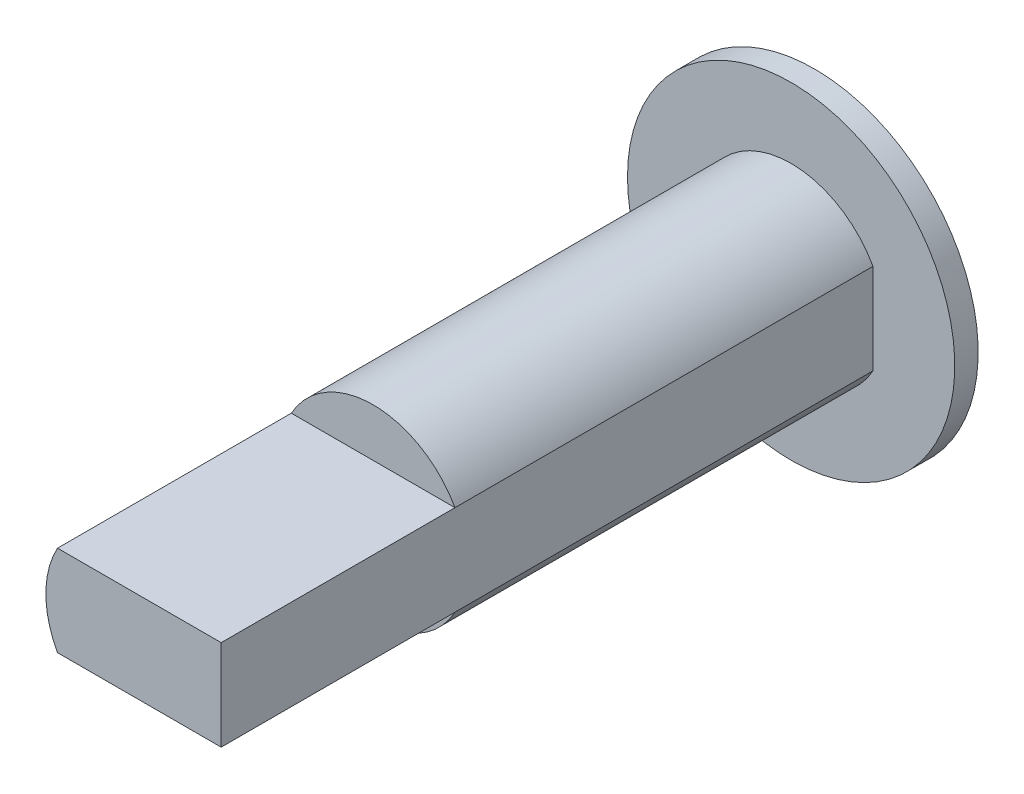
ISO-10303-21;
HEADER;
FILE_DESCRIPTION(('STEP AP214'),'2;1');
FILE_NAME('part.step','',(''),(''),'','','');
FILE_SCHEMA(('AUTOMOTIVE_DESIGN { 1 0 10303 214 1 1 1 1 }'));
ENDSEC;
DATA;
#1=APPLICATION_CONTEXT('core data for automotive mechanical design processes');
#2=APPLICATION_PROTOCOL_DEFINITION('international standard','automotive_design',2000,#1);
#3=PRODUCT_CONTEXT('',#1,'mechanical');
#4=PRODUCT('Part','Part','',(#3));
#5=PRODUCT_RELATED_PRODUCT_CATEGORY('part','',(#4));
#6=PRODUCT_DEFINITION_FORMATION('','',#4);
#7=PRODUCT_DEFINITION_CONTEXT('part definition',#1,'design');
#8=PRODUCT_DEFINITION('design','',#6,#7);
#9=PRODUCT_DEFINITION_SHAPE('','',#8);
#10=(LENGTH_UNIT() NAMED_UNIT(*) SI_UNIT(.MILLI.,.METRE.));
#11=(NAMED_UNIT(*) PLANE_ANGLE_UNIT() SI_UNIT($,.RADIAN.));
#12=(NAMED_UNIT(*) SI_UNIT($,.STERADIAN.) SOLID_ANGLE_UNIT());
#13=UNCERTAINTY_MEASURE_WITH_UNIT(LENGTH_MEASURE(1.E-05),#10,'distance_accuracy_value','');
#14=(GEOMETRIC_REPRESENTATION_CONTEXT(3) GLOBAL_UNCERTAINTY_ASSIGNED_CONTEXT((#13)) GLOBAL_UNIT_ASSIGNED_CONTEXT((#10,
#11,#12)) REPRESENTATION_CONTEXT('',''));
#15=CARTESIAN_POINT('',(0.,0.,0.));
#16=DIRECTION('',(0.,0.,1.));
#17=DIRECTION('',(1.,0.,0.));
#18=AXIS2_PLACEMENT_3D('',#15,#16,#17);
#19=CARTESIAN_POINT('',(0.,0.,-27.8796339));
#20=DIRECTION('',(0.,0.,1.));
#21=DIRECTION('',(1.,0.,0.));
#22=AXIS2_PLACEMENT_3D('',#19,#20,#21);
#23=CYLINDRICAL_SURFACE('',#22,4.);
#24=DIRECTION('',(0.,0.,1.));
#25=VECTOR('',#24,1.);
#26=CARTESIAN_POINT('',(-3.5,-1.93649167310371,-10.));
#27=LINE('',#26,#25);
#28=CARTESIAN_POINT('',(-3.5,-1.93649167310371,-10.));
#29=VERTEX_POINT('',#28);
#30=CARTESIAN_POINT('',(-3.5,-1.93649167310371,0.));
#31=VERTEX_POINT('',#30);
#32=EDGE_CURVE('E121',#29,#31,#27,.T.);
#33=ORIENTED_EDGE('',*,*,#32,.T.);
#34=CARTESIAN_POINT('',(0.,0.,0.));
#35=DIRECTION('',(0.,0.,1.));
#36=DIRECTION('',(1.,0.,0.));
#37=AXIS2_PLACEMENT_3D('',#34,#35,#36);
#38=CIRCLE('',#37,4.);
#39=CARTESIAN_POINT('',(-3.5,1.93649167310371,0.));
#40=VERTEX_POINT('',#39);
#41=EDGE_CURVE('E113',#40,#31,#38,.T.);
#42=ORIENTED_EDGE('',*,*,#41,.F.);
#43=DIRECTION('',(0.,0.,1.));
#44=VECTOR('',#43,1.);
#45=CARTESIAN_POINT('',(-3.5,1.93649167310371,-10.));
#46=LINE('',#45,#44);
#47=CARTESIAN_POINT('',(-3.5,1.93649167310371,-10.));
#48=VERTEX_POINT('',#47);
#49=EDGE_CURVE('E60',#48,#40,#46,.T.);
#50=ORIENTED_EDGE('',*,*,#49,.F.);
#51=CARTESIAN_POINT('',(0.,0.,-10.));
#52=DIRECTION('',(0.,0.,1.));
#53=DIRECTION('',(1.,0.,0.));
#54=AXIS2_PLACEMENT_3D('',#51,#52,#53);
#55=CIRCLE('',#54,4.);
#56=CARTESIAN_POINT('',(3.5,1.93649167310371,-10.));
#57=VERTEX_POINT('',#56);
#58=EDGE_CURVE('E116',#57,#48,#55,.T.);
#59=ORIENTED_EDGE('',*,*,#58,.F.);
#60=DIRECTION('',(0.,0.,1.));
#61=VECTOR('',#60,1.);
#62=CARTESIAN_POINT('',(3.5,1.93649167310371,-27.8796339));
#63=LINE('',#62,#61);
#64=CARTESIAN_POINT('',(3.5,1.93649167310371,-27.8796339));
#65=VERTEX_POINT('',#64);
#66=EDGE_CURVE('E11',#65,#57,#63,.T.);
#67=ORIENTED_EDGE('',*,*,#66,.F.);
#68=CARTESIAN_POINT('',(0.,0.,-27.8796339));
#69=DIRECTION('',(0.,0.,1.));
#70=DIRECTION('',(1.,0.,0.));
#71=AXIS2_PLACEMENT_3D('',#68,#69,#70);
#72=CIRCLE('',#71,4.);
#73=CARTESIAN_POINT('',(3.5,-1.93649167310371,-27.8796339));
#74=VERTEX_POINT('',#73);
#75=EDGE_CURVE('E68',#65,#74,#72,.T.);
#76=ORIENTED_EDGE('',*,*,#75,.T.);
#77=DIRECTION('',(0.,0.,1.));
#78=VECTOR('',#77,1.);
#79=CARTESIAN_POINT('',(3.5,-1.93649167310371,-27.8796339));
#80=LINE('',#79,#78);
#81=CARTESIAN_POINT('',(3.5,-1.93649167310371,-10.));
#82=VERTEX_POINT('',#81);
#83=EDGE_CURVE('E48',#74,#82,#80,.T.);
#84=ORIENTED_EDGE('',*,*,#83,.T.);
#85=CARTESIAN_POINT('',(0.,0.,-10.));
#86=DIRECTION('',(0.,0.,1.));
#87=DIRECTION('',(1.,0.,0.));
#88=AXIS2_PLACEMENT_3D('',#85,#86,#87);
#89=CIRCLE('',#88,4.);
#90=EDGE_CURVE('E153',#29,#82,#89,.T.);
#91=ORIENTED_EDGE('',*,*,#90,.F.);
#92=EDGE_LOOP('',(#33,#42,#50,#59,#67,#76,#84,#91));
#93=FACE_BOUND('',#92,.T.);
#94=ADVANCED_FACE('F45',(#93),#23,.T.);
#95=CARTESIAN_POINT('',(3.5,1.93649167310371,-27.8796339));
#96=DIRECTION('',(1.,0.,0.));
#97=DIRECTION('',(0.,0.,-1.));
#98=AXIS2_PLACEMENT_3D('',#95,#96,#97);
#99=PLANE('',#98);
#100=DIRECTION('',(0.,1.,0.));
#101=VECTOR('',#100,1.);
#102=CARTESIAN_POINT('',(3.5,1.93649167310371,0.));
#103=LINE('',#102,#101);
#104=CARTESIAN_POINT('',(3.5,-1.93649167310371,0.));
#105=VERTEX_POINT('',#104);
#106=CARTESIAN_POINT('',(3.5,1.93649167310371,0.));
#107=VERTEX_POINT('',#106);
#108=EDGE_CURVE('E109',#105,#107,#103,.T.);
#109=ORIENTED_EDGE('',*,*,#108,.F.);
#110=DIRECTION('',(0.,0.,1.));
#111=VECTOR('',#110,1.);
#112=CARTESIAN_POINT('',(3.5,-1.93649167310371,-10.));
#113=LINE('',#112,#111);
#114=EDGE_CURVE('E102',#82,#105,#113,.T.);
#115=ORIENTED_EDGE('',*,*,#114,.F.);
#116=ORIENTED_EDGE('',*,*,#83,.F.);
#117=DIRECTION('',(0.,1.,0.));
#118=VECTOR('',#117,1.);
#119=CARTESIAN_POINT('',(3.5,1.93649167310371,-27.8796339));
#120=LINE('',#119,#118);
#121=EDGE_CURVE('E91',#74,#65,#120,.T.);
#122=ORIENTED_EDGE('',*,*,#121,.T.);
#123=ORIENTED_EDGE('',*,*,#66,.T.);
#124=DIRECTION('',(0.,0.,1.));
#125=VECTOR('',#124,1.);
#126=CARTESIAN_POINT('',(3.5,1.93649167310371,-10.));
#127=LINE('',#126,#125);
#128=EDGE_CURVE('E137',#57,#107,#127,.T.);
#129=ORIENTED_EDGE('',*,*,#128,.T.);
#130=EDGE_LOOP('',(#109,#115,#116,#122,#123,#129));
#131=FACE_BOUND('',#130,.T.);
#132=ADVANCED_FACE('F101',(#131),#99,.T.);
#133=CARTESIAN_POINT('',(0.,0.,0.));
#134=DIRECTION('',(0.,0.,1.));
#135=DIRECTION('',(1.,0.,0.));
#136=AXIS2_PLACEMENT_3D('',#133,#134,#135);
#137=PLANE('',#136);
#138=DIRECTION('',(-1.,0.,0.));
#139=VECTOR('',#138,1.);
#140=CARTESIAN_POINT('',(3.5,-1.93649167310371,0.));
#141=LINE('',#140,#139);
#142=EDGE_CURVE('E131',#105,#31,#141,.T.);
#143=ORIENTED_EDGE('',*,*,#142,.F.);
#144=ORIENTED_EDGE('',*,*,#108,.T.);
#145=DIRECTION('',(1.,0.,0.));
#146=VECTOR('',#145,1.);
#147=CARTESIAN_POINT('',(3.5,1.93649167310371,0.));
#148=LINE('',#147,#146);
#149=EDGE_CURVE('E142',#40,#107,#148,.T.);
#150=ORIENTED_EDGE('',*,*,#149,.F.);
#151=ORIENTED_EDGE('',*,*,#41,.T.);
#152=EDGE_LOOP('',(#143,#144,#150,#151));
#153=FACE_BOUND('',#152,.T.);
#154=ADVANCED_FACE('F150',(#153),#137,.T.);
#155=CARTESIAN_POINT('',(3.5,1.93649167310371,-10.));
#156=DIRECTION('',(0.,-1.,0.));
#157=DIRECTION('',(0.,0.,-1.));
#158=AXIS2_PLACEMENT_3D('',#155,#156,#157);
#159=PLANE('',#158);
#160=ORIENTED_EDGE('',*,*,#149,.T.);
#161=ORIENTED_EDGE('',*,*,#128,.F.);
#162=DIRECTION('',(1.,0.,0.));
#163=VECTOR('',#162,1.);
#164=CARTESIAN_POINT('',(3.5,1.93649167310371,-10.));
#165=LINE('',#164,#163);
#166=EDGE_CURVE('E136',#48,#57,#165,.T.);
#167=ORIENTED_EDGE('',*,*,#166,.F.);
#168=ORIENTED_EDGE('',*,*,#49,.T.);
#169=EDGE_LOOP('',(#160,#161,#167,#168));
#170=FACE_BOUND('',#169,.T.);
#171=ADVANCED_FACE('F149',(#170),#159,.F.);
#172=CARTESIAN_POINT('',(0.,0.,-10.));
#173=DIRECTION('',(0.,0.,1.));
#174=DIRECTION('',(1.,0.,0.));
#175=AXIS2_PLACEMENT_3D('',#172,#173,#174);
#176=PLANE('',#175);
#177=ORIENTED_EDGE('',*,*,#58,.T.);
#178=ORIENTED_EDGE('',*,*,#166,.T.);
#179=EDGE_LOOP('',(#177,#178));
#180=FACE_BOUND('',#179,.T.);
#181=ADVANCED_FACE('F148',(#180),#176,.T.);
#182=CARTESIAN_POINT('',(3.5,-1.93649167310371,-10.));
#183=DIRECTION('',(0.,1.,0.));
#184=DIRECTION('',(0.,0.,1.));
#185=AXIS2_PLACEMENT_3D('',#182,#183,#184);
#186=PLANE('',#185);
#187=ORIENTED_EDGE('',*,*,#142,.T.);
#188=ORIENTED_EDGE('',*,*,#32,.F.);
#189=DIRECTION('',(-1.,0.,0.));
#190=VECTOR('',#189,1.);
#191=CARTESIAN_POINT('',(3.5,-1.93649167310371,-10.));
#192=LINE('',#191,#190);
#193=EDGE_CURVE('E128',#82,#29,#192,.T.);
#194=ORIENTED_EDGE('',*,*,#193,.F.);
#195=ORIENTED_EDGE('',*,*,#114,.T.);
#196=EDGE_LOOP('',(#187,#188,#194,#195));
#197=FACE_BOUND('',#196,.T.);
#198=ADVANCED_FACE('F195',(#197),#186,.F.);
#199=CARTESIAN_POINT('',(0.,0.,-10.));
#200=DIRECTION('',(0.,0.,1.));
#201=DIRECTION('',(1.,0.,0.));
#202=AXIS2_PLACEMENT_3D('',#199,#200,#201);
#203=PLANE('',#202);
#204=ORIENTED_EDGE('',*,*,#90,.T.);
#205=ORIENTED_EDGE('',*,*,#193,.T.);
#206=EDGE_LOOP('',(#204,#205));
#207=FACE_BOUND('',#206,.T.);
#208=ADVANCED_FACE('F174',(#207),#203,.T.);
#209=CARTESIAN_POINT('',(0.,0.,-28.8796339));
#210=DIRECTION('',(0.,0.,1.));
#211=DIRECTION('',(1.,0.,0.));
#212=AXIS2_PLACEMENT_3D('',#209,#210,#211);
#213=CYLINDRICAL_SURFACE('',#212,7.);
#214=CARTESIAN_POINT('',(0.,0.,-28.8796339));
#215=DIRECTION('',(0.,0.,-1.));
#216=DIRECTION('',(-1.,0.,0.));
#217=AXIS2_PLACEMENT_3D('',#214,#215,#216);
#218=CIRCLE('',#217,7.);
#219=CARTESIAN_POINT('',(-7.,0.,-28.8796339));
#220=VERTEX_POINT('',#219);
#221=EDGE_CURVE('E141',#220,#220,#218,.T.);
#222=ORIENTED_EDGE('',*,*,#221,.F.);
#223=EDGE_LOOP('',(#222));
#224=FACE_BOUND('',#223,.T.);
#225=CARTESIAN_POINT('',(0.,0.,-27.8796339));
#226=DIRECTION('',(0.,0.,-1.));
#227=DIRECTION('',(-1.,0.,0.));
#228=AXIS2_PLACEMENT_3D('',#225,#226,#227);
#229=CIRCLE('',#228,7.);
#230=CARTESIAN_POINT('',(-7.,0.,-27.8796339));
#231=VERTEX_POINT('',#230);
#232=EDGE_CURVE('E161',#231,#231,#229,.T.);
#233=ORIENTED_EDGE('',*,*,#232,.T.);
#234=EDGE_LOOP('',(#233));
#235=FACE_BOUND('',#234,.T.);
#236=ADVANCED_FACE('F171',(#224,#235),#213,.T.);
#237=CARTESIAN_POINT('',(0.,0.,-28.8796339));
#238=DIRECTION('',(0.,0.,-1.));
#239=DIRECTION('',(-1.,0.,0.));
#240=AXIS2_PLACEMENT_3D('',#237,#238,#239);
#241=PLANE('',#240);
#242=ORIENTED_EDGE('',*,*,#221,.T.);
#243=EDGE_LOOP('',(#242));
#244=FACE_BOUND('',#243,.T.);
#245=ADVANCED_FACE('F169',(#244),#241,.T.);
#246=CARTESIAN_POINT('',(0.,0.,-27.8796339));
#247=DIRECTION('',(0.,0.,-1.));
#248=DIRECTION('',(-1.,0.,0.));
#249=AXIS2_PLACEMENT_3D('',#246,#247,#248);
#250=PLANE('',#249);
#251=ORIENTED_EDGE('',*,*,#75,.F.);
#252=ORIENTED_EDGE('',*,*,#121,.F.);
#253=EDGE_LOOP('',(#251,#252));
#254=FACE_BOUND('',#253,.T.);
#255=ORIENTED_EDGE('',*,*,#232,.F.);
#256=EDGE_LOOP('',(#255));
#257=FACE_BOUND('',#256,.T.);
#258=ADVANCED_FACE('F93',(#254,#257),#250,.F.);
#259=CLOSED_SHELL('',(#94,#132,#154,#171,#181,#198,#208,#236,#245,#258));
#260=MANIFOLD_SOLID_BREP('B2',#259);
#261=ADVANCED_BREP_SHAPE_REPRESENTATION('',(#18,#260),#14);
#262=SHAPE_DEFINITION_REPRESENTATION(#9,#261);
ENDSEC;
END-ISO-10303-21;
